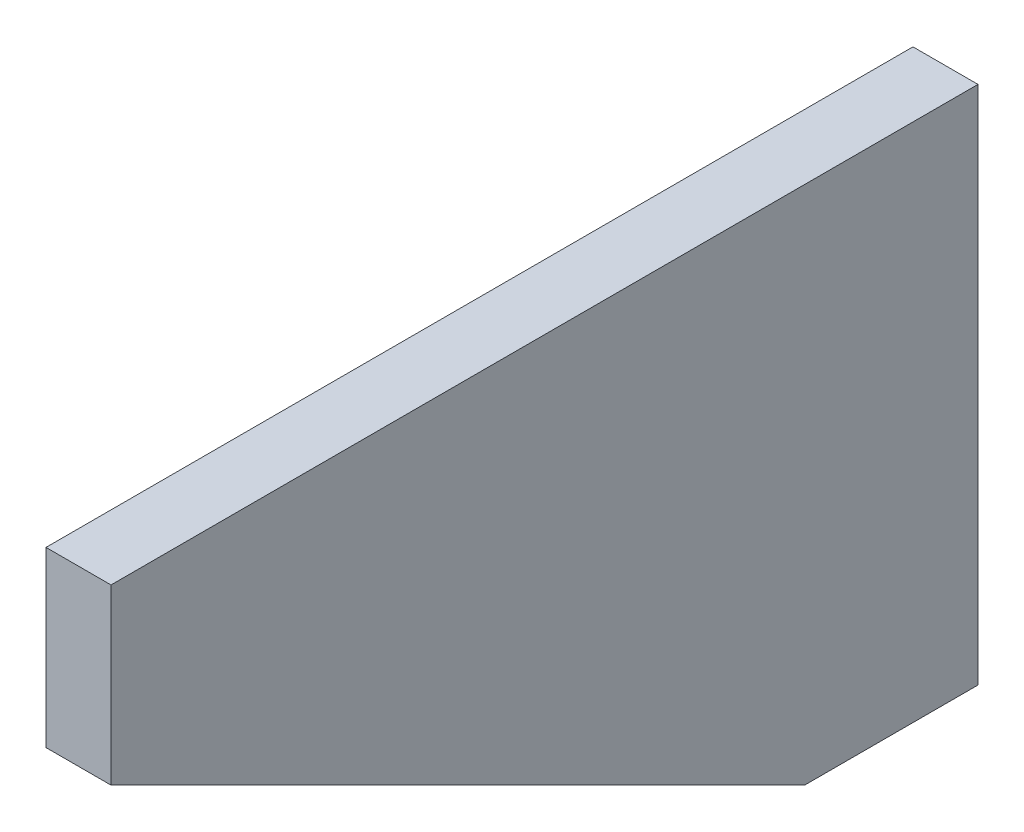
ISO-10303-21;
HEADER;
FILE_DESCRIPTION(('STEP AP214'),'2;1');
FILE_NAME('part.step','',(''),(''),'','','');
FILE_SCHEMA(('AUTOMOTIVE_DESIGN { 1 0 10303 214 1 1 1 1 }'));
ENDSEC;
DATA;
#1=APPLICATION_CONTEXT('core data for automotive mechanical design processes');
#2=APPLICATION_PROTOCOL_DEFINITION('international standard','automotive_design',2000,#1);
#3=PRODUCT_CONTEXT('',#1,'mechanical');
#4=PRODUCT('Part','Part','',(#3));
#5=PRODUCT_RELATED_PRODUCT_CATEGORY('part','',(#4));
#6=PRODUCT_DEFINITION_FORMATION('','',#4);
#7=PRODUCT_DEFINITION_CONTEXT('part definition',#1,'design');
#8=PRODUCT_DEFINITION('design','',#6,#7);
#9=PRODUCT_DEFINITION_SHAPE('','',#8);
#10=(LENGTH_UNIT() NAMED_UNIT(*) SI_UNIT(.MILLI.,.METRE.));
#11=(NAMED_UNIT(*) PLANE_ANGLE_UNIT() SI_UNIT($,.RADIAN.));
#12=(NAMED_UNIT(*) SI_UNIT($,.STERADIAN.) SOLID_ANGLE_UNIT());
#13=UNCERTAINTY_MEASURE_WITH_UNIT(LENGTH_MEASURE(1.E-05),#10,'distance_accuracy_value','');
#14=(GEOMETRIC_REPRESENTATION_CONTEXT(3) GLOBAL_UNCERTAINTY_ASSIGNED_CONTEXT((#13)) GLOBAL_UNIT_ASSIGNED_CONTEXT((#10,
#11,#12)) REPRESENTATION_CONTEXT('',''));
#15=CARTESIAN_POINT('',(0.,0.,0.));
#16=DIRECTION('',(0.,0.,1.));
#17=DIRECTION('',(1.,0.,0.));
#18=AXIS2_PLACEMENT_3D('',#15,#16,#17);
#19=CARTESIAN_POINT('',(9.525,0.,127.));
#20=DIRECTION('',(0.,-1.,0.));
#21=DIRECTION('',(0.,0.,-1.));
#22=AXIS2_PLACEMENT_3D('',#19,#20,#21);
#23=PLANE('',#22);
#24=DIRECTION('',(0.,0.,1.));
#25=VECTOR('',#24,1.);
#26=CARTESIAN_POINT('',(0.,0.,127.));
#27=LINE('',#26,#25);
#28=CARTESIAN_POINT('',(0.,0.,0.));
#29=VERTEX_POINT('',#28);
#30=CARTESIAN_POINT('',(0.,0.,127.));
#31=VERTEX_POINT('',#30);
#32=EDGE_CURVE('E108',#29,#31,#27,.T.);
#33=ORIENTED_EDGE('',*,*,#32,.T.);
#34=DIRECTION('',(-1.,0.,0.));
#35=VECTOR('',#34,1.);
#36=CARTESIAN_POINT('',(9.525,0.,127.));
#37=LINE('',#36,#35);
#38=CARTESIAN_POINT('',(9.525,0.,127.));
#39=VERTEX_POINT('',#38);
#40=EDGE_CURVE('E11',#39,#31,#37,.T.);
#41=ORIENTED_EDGE('',*,*,#40,.F.);
#42=DIRECTION('',(0.,0.,1.));
#43=VECTOR('',#42,1.);
#44=CARTESIAN_POINT('',(9.525,0.,127.));
#45=LINE('',#44,#43);
#46=CARTESIAN_POINT('',(9.525,0.,0.));
#47=VERTEX_POINT('',#46);
#48=EDGE_CURVE('E116',#47,#39,#45,.T.);
#49=ORIENTED_EDGE('',*,*,#48,.F.);
#50=DIRECTION('',(-1.,0.,0.));
#51=VECTOR('',#50,1.);
#52=CARTESIAN_POINT('',(9.525,0.,0.));
#53=LINE('',#52,#51);
#54=EDGE_CURVE('E104',#47,#29,#53,.T.);
#55=ORIENTED_EDGE('',*,*,#54,.T.);
#56=EDGE_LOOP('',(#33,#41,#49,#55));
#57=FACE_BOUND('',#56,.T.);
#58=ADVANCED_FACE('F34',(#57),#23,.F.);
#59=CARTESIAN_POINT('',(9.525,-25.4,127.));
#60=DIRECTION('',(0.,0.,-1.));
#61=DIRECTION('',(-1.,0.,0.));
#62=AXIS2_PLACEMENT_3D('',#59,#60,#61);
#63=PLANE('',#62);
#64=DIRECTION('',(0.,-1.,0.));
#65=VECTOR('',#64,1.);
#66=CARTESIAN_POINT('',(0.,-25.4,127.));
#67=LINE('',#66,#65);
#68=CARTESIAN_POINT('',(0.,-25.4,127.));
#69=VERTEX_POINT('',#68);
#70=EDGE_CURVE('E111',#31,#69,#67,.T.);
#71=ORIENTED_EDGE('',*,*,#70,.T.);
#72=DIRECTION('',(-1.,0.,0.));
#73=VECTOR('',#72,1.);
#74=CARTESIAN_POINT('',(9.525,-25.4,127.));
#75=LINE('',#74,#73);
#76=CARTESIAN_POINT('',(9.525,-25.4,127.));
#77=VERTEX_POINT('',#76);
#78=EDGE_CURVE('E42',#77,#69,#75,.T.);
#79=ORIENTED_EDGE('',*,*,#78,.F.);
#80=DIRECTION('',(0.,-1.,0.));
#81=VECTOR('',#80,1.);
#82=CARTESIAN_POINT('',(9.525,-25.4,127.));
#83=LINE('',#82,#81);
#84=EDGE_CURVE('E84',#39,#77,#83,.T.);
#85=ORIENTED_EDGE('',*,*,#84,.F.);
#86=ORIENTED_EDGE('',*,*,#40,.T.);
#87=EDGE_LOOP('',(#71,#79,#85,#86));
#88=FACE_BOUND('',#87,.T.);
#89=ADVANCED_FACE('F135',(#88),#63,.F.);
#90=CARTESIAN_POINT('',(9.525,-76.2,25.4));
#91=DIRECTION('',(0.,0.894427190999916,-0.447213595499958));
#92=DIRECTION('',(0.,0.447213595499958,0.894427190999916));
#93=AXIS2_PLACEMENT_3D('',#90,#91,#92);
#94=PLANE('',#93);
#95=DIRECTION('',(0.,-0.447213595499958,-0.894427190999916));
#96=VECTOR('',#95,1.);
#97=CARTESIAN_POINT('',(0.,-76.2,25.4));
#98=LINE('',#97,#96);
#99=CARTESIAN_POINT('',(0.,-76.2,25.4));
#100=VERTEX_POINT('',#99);
#101=EDGE_CURVE('E99',#69,#100,#98,.T.);
#102=ORIENTED_EDGE('',*,*,#101,.T.);
#103=DIRECTION('',(-1.,0.,0.));
#104=VECTOR('',#103,1.);
#105=CARTESIAN_POINT('',(9.525,-76.2,25.4));
#106=LINE('',#105,#104);
#107=CARTESIAN_POINT('',(9.525,-76.2,25.4));
#108=VERTEX_POINT('',#107);
#109=EDGE_CURVE('E96',#108,#100,#106,.T.);
#110=ORIENTED_EDGE('',*,*,#109,.F.);
#111=DIRECTION('',(0.,-0.447213595499958,-0.894427190999916));
#112=VECTOR('',#111,1.);
#113=CARTESIAN_POINT('',(9.525,-76.2,25.4));
#114=LINE('',#113,#112);
#115=EDGE_CURVE('E88',#77,#108,#114,.T.);
#116=ORIENTED_EDGE('',*,*,#115,.F.);
#117=ORIENTED_EDGE('',*,*,#78,.T.);
#118=EDGE_LOOP('',(#102,#110,#116,#117));
#119=FACE_BOUND('',#118,.T.);
#120=ADVANCED_FACE('F97',(#119),#94,.F.);
#121=CARTESIAN_POINT('',(9.525,-76.2,0.));
#122=DIRECTION('',(0.,1.,0.));
#123=DIRECTION('',(0.,0.,1.));
#124=AXIS2_PLACEMENT_3D('',#121,#122,#123);
#125=PLANE('',#124);
#126=DIRECTION('',(0.,0.,-1.));
#127=VECTOR('',#126,1.);
#128=CARTESIAN_POINT('',(0.,-76.2,0.));
#129=LINE('',#128,#127);
#130=CARTESIAN_POINT('',(0.,-76.2,0.));
#131=VERTEX_POINT('',#130);
#132=EDGE_CURVE('E70',#100,#131,#129,.T.);
#133=ORIENTED_EDGE('',*,*,#132,.T.);
#134=DIRECTION('',(-1.,0.,0.));
#135=VECTOR('',#134,1.);
#136=CARTESIAN_POINT('',(9.525,-76.2,0.));
#137=LINE('',#136,#135);
#138=CARTESIAN_POINT('',(9.525,-76.2,0.));
#139=VERTEX_POINT('',#138);
#140=EDGE_CURVE('E100',#139,#131,#137,.T.);
#141=ORIENTED_EDGE('',*,*,#140,.F.);
#142=DIRECTION('',(0.,0.,-1.));
#143=VECTOR('',#142,1.);
#144=CARTESIAN_POINT('',(9.525,-76.2,0.));
#145=LINE('',#144,#143);
#146=EDGE_CURVE('E92',#108,#139,#145,.T.);
#147=ORIENTED_EDGE('',*,*,#146,.F.);
#148=ORIENTED_EDGE('',*,*,#109,.T.);
#149=EDGE_LOOP('',(#133,#141,#147,#148));
#150=FACE_BOUND('',#149,.T.);
#151=ADVANCED_FACE('F102',(#150),#125,.F.);
#152=CARTESIAN_POINT('',(9.525,0.,0.));
#153=DIRECTION('',(0.,0.,1.));
#154=DIRECTION('',(0.,-1.,0.));
#155=AXIS2_PLACEMENT_3D('',#152,#153,#154);
#156=PLANE('',#155);
#157=DIRECTION('',(0.,1.,0.));
#158=VECTOR('',#157,1.);
#159=CARTESIAN_POINT('',(0.,0.,0.));
#160=LINE('',#159,#158);
#161=EDGE_CURVE('E76',#131,#29,#160,.T.);
#162=ORIENTED_EDGE('',*,*,#161,.T.);
#163=ORIENTED_EDGE('',*,*,#54,.F.);
#164=DIRECTION('',(0.,1.,0.));
#165=VECTOR('',#164,1.);
#166=CARTESIAN_POINT('',(9.525,0.,0.));
#167=LINE('',#166,#165);
#168=EDGE_CURVE('E50',#139,#47,#167,.T.);
#169=ORIENTED_EDGE('',*,*,#168,.F.);
#170=ORIENTED_EDGE('',*,*,#140,.T.);
#171=EDGE_LOOP('',(#162,#163,#169,#170));
#172=FACE_BOUND('',#171,.T.);
#173=ADVANCED_FACE('F124',(#172),#156,.F.);
#174=CARTESIAN_POINT('',(9.525,0.,0.));
#175=DIRECTION('',(-1.,0.,0.));
#176=DIRECTION('',(0.,0.,1.));
#177=AXIS2_PLACEMENT_3D('',#174,#175,#176);
#178=PLANE('',#177);
#179=ORIENTED_EDGE('',*,*,#48,.T.);
#180=ORIENTED_EDGE('',*,*,#84,.T.);
#181=ORIENTED_EDGE('',*,*,#115,.T.);
#182=ORIENTED_EDGE('',*,*,#146,.T.);
#183=ORIENTED_EDGE('',*,*,#168,.T.);
#184=EDGE_LOOP('',(#179,#180,#181,#182,#183));
#185=FACE_BOUND('',#184,.T.);
#186=ADVANCED_FACE('F90',(#185),#178,.F.);
#187=CARTESIAN_POINT('',(0.,0.,0.));
#188=DIRECTION('',(-1.,0.,0.));
#189=DIRECTION('',(0.,0.,1.));
#190=AXIS2_PLACEMENT_3D('',#187,#188,#189);
#191=PLANE('',#190);
#192=ORIENTED_EDGE('',*,*,#32,.F.);
#193=ORIENTED_EDGE('',*,*,#161,.F.);
#194=ORIENTED_EDGE('',*,*,#132,.F.);
#195=ORIENTED_EDGE('',*,*,#101,.F.);
#196=ORIENTED_EDGE('',*,*,#70,.F.);
#197=EDGE_LOOP('',(#192,#193,#194,#195,#196));
#198=FACE_BOUND('',#197,.T.);
#199=ADVANCED_FACE('F120',(#198),#191,.T.);
#200=CLOSED_SHELL('',(#58,#89,#120,#151,#173,#186,#199));
#201=MANIFOLD_SOLID_BREP('B2',#200);
#202=ADVANCED_BREP_SHAPE_REPRESENTATION('',(#18,#201),#14);
#203=SHAPE_DEFINITION_REPRESENTATION(#9,#202);
ENDSEC;
END-ISO-10303-21;
